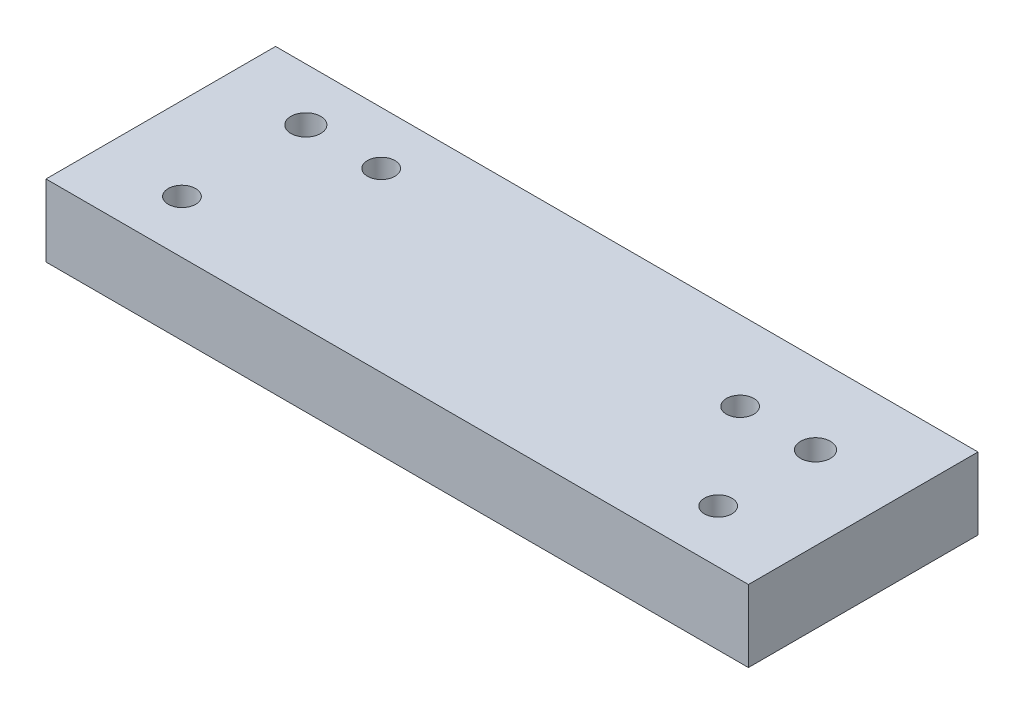
ISO-10303-21;
HEADER;
FILE_DESCRIPTION(('STEP AP214'),'2;1');
FILE_NAME('part.step','',(''),(''),'','','');
FILE_SCHEMA(('AUTOMOTIVE_DESIGN { 1 0 10303 214 1 1 1 1 }'));
ENDSEC;
DATA;
#1=APPLICATION_CONTEXT('core data for automotive mechanical design processes');
#2=APPLICATION_PROTOCOL_DEFINITION('international standard','automotive_design',2000,#1);
#3=PRODUCT_CONTEXT('',#1,'mechanical');
#4=PRODUCT('Part','Part','',(#3));
#5=PRODUCT_RELATED_PRODUCT_CATEGORY('part','',(#4));
#6=PRODUCT_DEFINITION_FORMATION('','',#4);
#7=PRODUCT_DEFINITION_CONTEXT('part definition',#1,'design');
#8=PRODUCT_DEFINITION('design','',#6,#7);
#9=PRODUCT_DEFINITION_SHAPE('','',#8);
#10=(LENGTH_UNIT() NAMED_UNIT(*) SI_UNIT(.MILLI.,.METRE.));
#11=(NAMED_UNIT(*) PLANE_ANGLE_UNIT() SI_UNIT($,.RADIAN.));
#12=(NAMED_UNIT(*) SI_UNIT($,.STERADIAN.) SOLID_ANGLE_UNIT());
#13=UNCERTAINTY_MEASURE_WITH_UNIT(LENGTH_MEASURE(1.E-05),#10,'distance_accuracy_value','');
#14=(GEOMETRIC_REPRESENTATION_CONTEXT(3) GLOBAL_UNCERTAINTY_ASSIGNED_CONTEXT((#13)) GLOBAL_UNIT_ASSIGNED_CONTEXT((#10,
#11,#12)) REPRESENTATION_CONTEXT('',''));
#15=CARTESIAN_POINT('',(0.,0.,0.));
#16=DIRECTION('',(0.,0.,1.));
#17=DIRECTION('',(1.,0.,0.));
#18=AXIS2_PLACEMENT_3D('',#15,#16,#17);
#19=CARTESIAN_POINT('',(102.5,21.,-33.5));
#20=DIRECTION('',(-1.,0.,0.));
#21=DIRECTION('',(0.,0.,1.));
#22=AXIS2_PLACEMENT_3D('',#19,#20,#21);
#23=PLANE('',#22);
#24=DIRECTION('',(0.,0.,-1.));
#25=VECTOR('',#24,1.);
#26=CARTESIAN_POINT('',(102.5,0.,-33.5));
#27=LINE('',#26,#25);
#28=CARTESIAN_POINT('',(102.5,0.,33.5));
#29=VERTEX_POINT('',#28);
#30=CARTESIAN_POINT('',(102.5,0.,-33.5));
#31=VERTEX_POINT('',#30);
#32=EDGE_CURVE('E96',#29,#31,#27,.T.);
#33=ORIENTED_EDGE('',*,*,#32,.T.);
#34=DIRECTION('',(0.,-1.,0.));
#35=VECTOR('',#34,1.);
#36=CARTESIAN_POINT('',(102.5,21.,-33.5));
#37=LINE('',#36,#35);
#38=CARTESIAN_POINT('',(102.5,21.,-33.5));
#39=VERTEX_POINT('',#38);
#40=EDGE_CURVE('E11',#39,#31,#37,.T.);
#41=ORIENTED_EDGE('',*,*,#40,.F.);
#42=DIRECTION('',(0.,0.,-1.));
#43=VECTOR('',#42,1.);
#44=CARTESIAN_POINT('',(102.5,21.,-33.5));
#45=LINE('',#44,#43);
#46=CARTESIAN_POINT('',(102.5,21.,33.5));
#47=VERTEX_POINT('',#46);
#48=EDGE_CURVE('E84',#47,#39,#45,.T.);
#49=ORIENTED_EDGE('',*,*,#48,.F.);
#50=DIRECTION('',(0.,-1.,0.));
#51=VECTOR('',#50,1.);
#52=CARTESIAN_POINT('',(102.5,21.,33.5));
#53=LINE('',#52,#51);
#54=EDGE_CURVE('E92',#47,#29,#53,.T.);
#55=ORIENTED_EDGE('',*,*,#54,.T.);
#56=EDGE_LOOP('',(#33,#41,#49,#55));
#57=FACE_BOUND('',#56,.T.);
#58=ADVANCED_FACE('F33',(#57),#23,.F.);
#59=CARTESIAN_POINT('',(-102.5,21.,-33.5));
#60=DIRECTION('',(0.,0.,1.));
#61=DIRECTION('',(1.,0.,0.));
#62=AXIS2_PLACEMENT_3D('',#59,#60,#61);
#63=PLANE('',#62);
#64=DIRECTION('',(-1.,0.,0.));
#65=VECTOR('',#64,1.);
#66=CARTESIAN_POINT('',(-102.5,0.,-33.5));
#67=LINE('',#66,#65);
#68=CARTESIAN_POINT('',(-102.5,0.,-33.5));
#69=VERTEX_POINT('',#68);
#70=EDGE_CURVE('E88',#31,#69,#67,.T.);
#71=ORIENTED_EDGE('',*,*,#70,.T.);
#72=DIRECTION('',(0.,-1.,0.));
#73=VECTOR('',#72,1.);
#74=CARTESIAN_POINT('',(-102.5,21.,-33.5));
#75=LINE('',#74,#73);
#76=CARTESIAN_POINT('',(-102.5,21.,-33.5));
#77=VERTEX_POINT('',#76);
#78=EDGE_CURVE('E41',#77,#69,#75,.T.);
#79=ORIENTED_EDGE('',*,*,#78,.F.);
#80=DIRECTION('',(-1.,0.,0.));
#81=VECTOR('',#80,1.);
#82=CARTESIAN_POINT('',(-102.5,21.,-33.5));
#83=LINE('',#82,#81);
#84=EDGE_CURVE('E79',#39,#77,#83,.T.);
#85=ORIENTED_EDGE('',*,*,#84,.F.);
#86=ORIENTED_EDGE('',*,*,#40,.T.);
#87=EDGE_LOOP('',(#71,#79,#85,#86));
#88=FACE_BOUND('',#87,.T.);
#89=ADVANCED_FACE('F87',(#88),#63,.F.);
#90=CARTESIAN_POINT('',(-102.5,21.,-33.5));
#91=DIRECTION('',(1.,0.,0.));
#92=DIRECTION('',(0.,0.,-1.));
#93=AXIS2_PLACEMENT_3D('',#90,#91,#92);
#94=PLANE('',#93);
#95=DIRECTION('',(0.,0.,1.));
#96=VECTOR('',#95,1.);
#97=CARTESIAN_POINT('',(-102.5,0.,-33.5));
#98=LINE('',#97,#96);
#99=CARTESIAN_POINT('',(-102.5,0.,33.5));
#100=VERTEX_POINT('',#99);
#101=EDGE_CURVE('E66',#69,#100,#98,.T.);
#102=ORIENTED_EDGE('',*,*,#101,.T.);
#103=DIRECTION('',(0.,-1.,0.));
#104=VECTOR('',#103,1.);
#105=CARTESIAN_POINT('',(-102.5,21.,33.5));
#106=LINE('',#105,#104);
#107=CARTESIAN_POINT('',(-102.5,21.,33.5));
#108=VERTEX_POINT('',#107);
#109=EDGE_CURVE('E89',#108,#100,#106,.T.);
#110=ORIENTED_EDGE('',*,*,#109,.F.);
#111=DIRECTION('',(0.,0.,1.));
#112=VECTOR('',#111,1.);
#113=CARTESIAN_POINT('',(-102.5,21.,-33.5));
#114=LINE('',#113,#112);
#115=EDGE_CURVE('E82',#77,#108,#114,.T.);
#116=ORIENTED_EDGE('',*,*,#115,.F.);
#117=ORIENTED_EDGE('',*,*,#78,.T.);
#118=EDGE_LOOP('',(#102,#110,#116,#117));
#119=FACE_BOUND('',#118,.T.);
#120=ADVANCED_FACE('F90',(#119),#94,.F.);
#121=CARTESIAN_POINT('',(-102.5,21.,33.5));
#122=DIRECTION('',(0.,0.,-1.));
#123=DIRECTION('',(-1.,0.,0.));
#124=AXIS2_PLACEMENT_3D('',#121,#122,#123);
#125=PLANE('',#124);
#126=DIRECTION('',(1.,0.,0.));
#127=VECTOR('',#126,1.);
#128=CARTESIAN_POINT('',(-102.5,0.,33.5));
#129=LINE('',#128,#127);
#130=EDGE_CURVE('E72',#100,#29,#129,.T.);
#131=ORIENTED_EDGE('',*,*,#130,.T.);
#132=ORIENTED_EDGE('',*,*,#54,.F.);
#133=DIRECTION('',(1.,0.,0.));
#134=VECTOR('',#133,1.);
#135=CARTESIAN_POINT('',(-102.5,21.,33.5));
#136=LINE('',#135,#134);
#137=EDGE_CURVE('E49',#108,#47,#136,.T.);
#138=ORIENTED_EDGE('',*,*,#137,.F.);
#139=ORIENTED_EDGE('',*,*,#109,.T.);
#140=EDGE_LOOP('',(#131,#132,#138,#139));
#141=FACE_BOUND('',#140,.T.);
#142=ADVANCED_FACE('F104',(#141),#125,.F.);
#143=CARTESIAN_POINT('',(0.,21.,0.));
#144=DIRECTION('',(0.,1.,0.));
#145=DIRECTION('',(0.,0.,1.));
#146=AXIS2_PLACEMENT_3D('',#143,#144,#145);
#147=PLANE('',#146);
#148=CARTESIAN_POINT('',(78.25,21.,-10.325));
#149=DIRECTION('',(0.,1.,0.));
#150=DIRECTION('',(0.,0.,1.));
#151=AXIS2_PLACEMENT_3D('',#148,#149,#150);
#152=CIRCLE('',#151,4.34999999999997);
#153=CARTESIAN_POINT('',(78.25,21.,-5.97500000000004));
#154=VERTEX_POINT('',#153);
#155=EDGE_CURVE('E115',#154,#154,#152,.F.);
#156=ORIENTED_EDGE('',*,*,#155,.T.);
#157=EDGE_LOOP('',(#156));
#158=FACE_BOUND('',#157,.T.);
#159=CARTESIAN_POINT('',(78.25,21.,18.075));
#160=DIRECTION('',(0.,1.,0.));
#161=DIRECTION('',(0.,0.,1.));
#162=AXIS2_PLACEMENT_3D('',#159,#160,#161);
#163=CIRCLE('',#162,4.00000000000001);
#164=CARTESIAN_POINT('',(78.25,21.,22.075));
#165=VERTEX_POINT('',#164);
#166=EDGE_CURVE('E130',#165,#165,#163,.F.);
#167=ORIENTED_EDGE('',*,*,#166,.T.);
#168=EDGE_LOOP('',(#167));
#169=FACE_BOUND('',#168,.T.);
#170=CARTESIAN_POINT('',(-78.25,21.,18.075));
#171=DIRECTION('',(0.,1.,0.));
#172=DIRECTION('',(0.,0.,1.));
#173=AXIS2_PLACEMENT_3D('',#170,#171,#172);
#174=CIRCLE('',#173,4.00000000000001);
#175=CARTESIAN_POINT('',(-78.25,21.,22.075));
#176=VERTEX_POINT('',#175);
#177=EDGE_CURVE('E124',#176,#176,#174,.F.);
#178=ORIENTED_EDGE('',*,*,#177,.T.);
#179=EDGE_LOOP('',(#178));
#180=FACE_BOUND('',#179,.T.);
#181=CARTESIAN_POINT('',(-56.25,21.,-18.075));
#182=DIRECTION('',(0.,1.,0.));
#183=DIRECTION('',(0.,0.,1.));
#184=AXIS2_PLACEMENT_3D('',#181,#182,#183);
#185=CIRCLE('',#184,4.);
#186=CARTESIAN_POINT('',(-56.25,21.,-14.075));
#187=VERTEX_POINT('',#186);
#188=EDGE_CURVE('E116',#187,#187,#185,.F.);
#189=ORIENTED_EDGE('',*,*,#188,.T.);
#190=EDGE_LOOP('',(#189));
#191=FACE_BOUND('',#190,.T.);
#192=CARTESIAN_POINT('',(56.25,21.,-10.325));
#193=DIRECTION('',(0.,1.,0.));
#194=DIRECTION('',(0.,0.,1.));
#195=AXIS2_PLACEMENT_3D('',#192,#193,#194);
#196=CIRCLE('',#195,4.00000000000001);
#197=CARTESIAN_POINT('',(56.25,21.,-6.32500000000001));
#198=VERTEX_POINT('',#197);
#199=EDGE_CURVE('E123',#198,#198,#196,.F.);
#200=ORIENTED_EDGE('',*,*,#199,.T.);
#201=EDGE_LOOP('',(#200));
#202=FACE_BOUND('',#201,.T.);
#203=CARTESIAN_POINT('',(-78.25,21.,-18.075));
#204=DIRECTION('',(0.,1.,0.));
#205=DIRECTION('',(0.,0.,1.));
#206=AXIS2_PLACEMENT_3D('',#203,#204,#205);
#207=CIRCLE('',#206,4.34999999999997);
#208=CARTESIAN_POINT('',(-78.25,21.,-13.725));
#209=VERTEX_POINT('',#208);
#210=EDGE_CURVE('E99',#209,#209,#207,.F.);
#211=ORIENTED_EDGE('',*,*,#210,.T.);
#212=EDGE_LOOP('',(#211));
#213=FACE_BOUND('',#212,.T.);
#214=ORIENTED_EDGE('',*,*,#48,.T.);
#215=ORIENTED_EDGE('',*,*,#84,.T.);
#216=ORIENTED_EDGE('',*,*,#115,.T.);
#217=ORIENTED_EDGE('',*,*,#137,.T.);
#218=EDGE_LOOP('',(#214,#215,#216,#217));
#219=FACE_BOUND('',#218,.T.);
#220=ADVANCED_FACE('F80',(#158,#169,#180,#191,#202,#213,#219),#147,.T.);
#221=CARTESIAN_POINT('',(0.,0.,0.));
#222=DIRECTION('',(0.,1.,0.));
#223=DIRECTION('',(0.,0.,1.));
#224=AXIS2_PLACEMENT_3D('',#221,#222,#223);
#225=PLANE('',#224);
#226=CARTESIAN_POINT('',(78.25,0.,-10.325));
#227=DIRECTION('',(0.,-1.,0.));
#228=DIRECTION('',(0.,0.,-1.));
#229=AXIS2_PLACEMENT_3D('',#226,#227,#228);
#230=CIRCLE('',#229,4.34999999999997);
#231=CARTESIAN_POINT('',(78.25,0.,-14.675));
#232=VERTEX_POINT('',#231);
#233=EDGE_CURVE('E133',#232,#232,#230,.T.);
#234=ORIENTED_EDGE('',*,*,#233,.F.);
#235=EDGE_LOOP('',(#234));
#236=FACE_BOUND('',#235,.T.);
#237=CARTESIAN_POINT('',(78.25,0.,18.075));
#238=DIRECTION('',(0.,-1.,0.));
#239=DIRECTION('',(0.,0.,-1.));
#240=AXIS2_PLACEMENT_3D('',#237,#238,#239);
#241=CIRCLE('',#240,4.00000000000001);
#242=CARTESIAN_POINT('',(78.25,0.,14.075));
#243=VERTEX_POINT('',#242);
#244=EDGE_CURVE('E127',#243,#243,#241,.T.);
#245=ORIENTED_EDGE('',*,*,#244,.F.);
#246=EDGE_LOOP('',(#245));
#247=FACE_BOUND('',#246,.T.);
#248=CARTESIAN_POINT('',(-78.25,0.,18.075));
#249=DIRECTION('',(0.,-1.,0.));
#250=DIRECTION('',(0.,0.,-1.));
#251=AXIS2_PLACEMENT_3D('',#248,#249,#250);
#252=CIRCLE('',#251,4.00000000000001);
#253=CARTESIAN_POINT('',(-78.25,0.,14.075));
#254=VERTEX_POINT('',#253);
#255=EDGE_CURVE('E119',#254,#254,#252,.T.);
#256=ORIENTED_EDGE('',*,*,#255,.F.);
#257=EDGE_LOOP('',(#256));
#258=FACE_BOUND('',#257,.T.);
#259=CARTESIAN_POINT('',(-56.25,0.,-18.075));
#260=DIRECTION('',(0.,-1.,0.));
#261=DIRECTION('',(0.,0.,-1.));
#262=AXIS2_PLACEMENT_3D('',#259,#260,#261);
#263=CIRCLE('',#262,4.);
#264=CARTESIAN_POINT('',(-56.25,0.,-22.075));
#265=VERTEX_POINT('',#264);
#266=EDGE_CURVE('E120',#265,#265,#263,.T.);
#267=ORIENTED_EDGE('',*,*,#266,.F.);
#268=EDGE_LOOP('',(#267));
#269=FACE_BOUND('',#268,.T.);
#270=CARTESIAN_POINT('',(56.25,0.,-10.325));
#271=DIRECTION('',(0.,-1.,0.));
#272=DIRECTION('',(0.,0.,-1.));
#273=AXIS2_PLACEMENT_3D('',#270,#271,#272);
#274=CIRCLE('',#273,4.00000000000001);
#275=CARTESIAN_POINT('',(56.25,0.,-14.325));
#276=VERTEX_POINT('',#275);
#277=EDGE_CURVE('E142',#276,#276,#274,.T.);
#278=ORIENTED_EDGE('',*,*,#277,.F.);
#279=EDGE_LOOP('',(#278));
#280=FACE_BOUND('',#279,.T.);
#281=CARTESIAN_POINT('',(-78.25,0.,-18.075));
#282=DIRECTION('',(0.,-1.,0.));
#283=DIRECTION('',(0.,0.,-1.));
#284=AXIS2_PLACEMENT_3D('',#281,#282,#283);
#285=CIRCLE('',#284,4.34999999999997);
#286=CARTESIAN_POINT('',(-78.25,0.,-22.425));
#287=VERTEX_POINT('',#286);
#288=EDGE_CURVE('E112',#287,#287,#285,.T.);
#289=ORIENTED_EDGE('',*,*,#288,.F.);
#290=EDGE_LOOP('',(#289));
#291=FACE_BOUND('',#290,.T.);
#292=ORIENTED_EDGE('',*,*,#32,.F.);
#293=ORIENTED_EDGE('',*,*,#130,.F.);
#294=ORIENTED_EDGE('',*,*,#101,.F.);
#295=ORIENTED_EDGE('',*,*,#70,.F.);
#296=EDGE_LOOP('',(#292,#293,#294,#295));
#297=FACE_BOUND('',#296,.T.);
#298=ADVANCED_FACE('F107',(#236,#247,#258,#269,#280,#291,#297),#225,.F.);
#299=CARTESIAN_POINT('',(-78.25,33.3036579926458,-18.075));
#300=DIRECTION('',(0.,-1.,0.));
#301=DIRECTION('',(0.,0.,-1.));
#302=AXIS2_PLACEMENT_3D('',#299,#300,#301);
#303=CYLINDRICAL_SURFACE('',#302,4.34999999999997);
#304=ORIENTED_EDGE('',*,*,#288,.T.);
#305=EDGE_LOOP('',(#304));
#306=FACE_BOUND('',#305,.T.);
#307=ORIENTED_EDGE('',*,*,#210,.F.);
#308=EDGE_LOOP('',(#307));
#309=FACE_BOUND('',#308,.T.);
#310=ADVANCED_FACE('F151',(#306,#309),#303,.F.);
#311=CARTESIAN_POINT('',(56.25,33.3036579926458,-10.325));
#312=DIRECTION('',(0.,-1.,0.));
#313=DIRECTION('',(0.,0.,-1.));
#314=AXIS2_PLACEMENT_3D('',#311,#312,#313);
#315=CYLINDRICAL_SURFACE('',#314,4.00000000000001);
#316=ORIENTED_EDGE('',*,*,#277,.T.);
#317=EDGE_LOOP('',(#316));
#318=FACE_BOUND('',#317,.T.);
#319=ORIENTED_EDGE('',*,*,#199,.F.);
#320=EDGE_LOOP('',(#319));
#321=FACE_BOUND('',#320,.T.);
#322=ADVANCED_FACE('F146',(#318,#321),#315,.F.);
#323=CARTESIAN_POINT('',(-56.25,33.3036579926458,-18.075));
#324=DIRECTION('',(0.,-1.,0.));
#325=DIRECTION('',(0.,0.,-1.));
#326=AXIS2_PLACEMENT_3D('',#323,#324,#325);
#327=CYLINDRICAL_SURFACE('',#326,4.);
#328=ORIENTED_EDGE('',*,*,#266,.T.);
#329=EDGE_LOOP('',(#328));
#330=FACE_BOUND('',#329,.T.);
#331=ORIENTED_EDGE('',*,*,#188,.F.);
#332=EDGE_LOOP('',(#331));
#333=FACE_BOUND('',#332,.T.);
#334=ADVANCED_FACE('F208',(#330,#333),#327,.F.);
#335=CARTESIAN_POINT('',(-78.25,33.3036579926458,18.075));
#336=DIRECTION('',(0.,-1.,0.));
#337=DIRECTION('',(0.,0.,-1.));
#338=AXIS2_PLACEMENT_3D('',#335,#336,#337);
#339=CYLINDRICAL_SURFACE('',#338,4.00000000000001);
#340=ORIENTED_EDGE('',*,*,#255,.T.);
#341=EDGE_LOOP('',(#340));
#342=FACE_BOUND('',#341,.T.);
#343=ORIENTED_EDGE('',*,*,#177,.F.);
#344=EDGE_LOOP('',(#343));
#345=FACE_BOUND('',#344,.T.);
#346=ADVANCED_FACE('F217',(#342,#345),#339,.F.);
#347=CARTESIAN_POINT('',(78.25,33.3036579926458,18.075));
#348=DIRECTION('',(0.,-1.,0.));
#349=DIRECTION('',(0.,0.,-1.));
#350=AXIS2_PLACEMENT_3D('',#347,#348,#349);
#351=CYLINDRICAL_SURFACE('',#350,4.00000000000001);
#352=ORIENTED_EDGE('',*,*,#244,.T.);
#353=EDGE_LOOP('',(#352));
#354=FACE_BOUND('',#353,.T.);
#355=ORIENTED_EDGE('',*,*,#166,.F.);
#356=EDGE_LOOP('',(#355));
#357=FACE_BOUND('',#356,.T.);
#358=ADVANCED_FACE('F227',(#354,#357),#351,.F.);
#359=CARTESIAN_POINT('',(78.25,33.3036579926458,-10.325));
#360=DIRECTION('',(0.,-1.,0.));
#361=DIRECTION('',(0.,0.,-1.));
#362=AXIS2_PLACEMENT_3D('',#359,#360,#361);
#363=CYLINDRICAL_SURFACE('',#362,4.34999999999997);
#364=ORIENTED_EDGE('',*,*,#233,.T.);
#365=EDGE_LOOP('',(#364));
#366=FACE_BOUND('',#365,.T.);
#367=ORIENTED_EDGE('',*,*,#155,.F.);
#368=EDGE_LOOP('',(#367));
#369=FACE_BOUND('',#368,.T.);
#370=ADVANCED_FACE('F237',(#366,#369),#363,.F.);
#371=CLOSED_SHELL('',(#58,#89,#120,#142,#220,#298,#310,#322,#334,#346,#358,#370));
#372=MANIFOLD_SOLID_BREP('B2',#371);
#373=ADVANCED_BREP_SHAPE_REPRESENTATION('',(#18,#372),#14);
#374=SHAPE_DEFINITION_REPRESENTATION(#9,#373);
ENDSEC;
END-ISO-10303-21;
